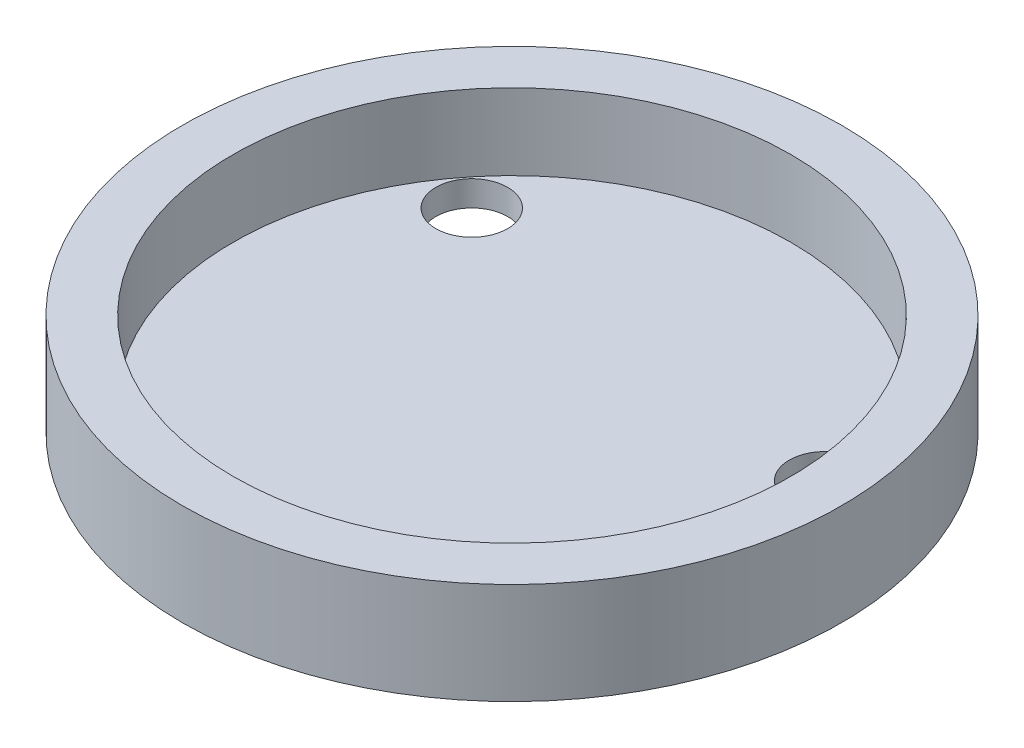
ISO-10303-21;
HEADER;
FILE_DESCRIPTION(('STEP AP214'),'2;1');
FILE_NAME('part.step','',(''),(''),'','','');
FILE_SCHEMA(('AUTOMOTIVE_DESIGN { 1 0 10303 214 1 1 1 1 }'));
ENDSEC;
DATA;
#1=APPLICATION_CONTEXT('core data for automotive mechanical design processes');
#2=APPLICATION_PROTOCOL_DEFINITION('international standard','automotive_design',2000,#1);
#3=PRODUCT_CONTEXT('',#1,'mechanical');
#4=PRODUCT('Part','Part','',(#3));
#5=PRODUCT_RELATED_PRODUCT_CATEGORY('part','',(#4));
#6=PRODUCT_DEFINITION_FORMATION('','',#4);
#7=PRODUCT_DEFINITION_CONTEXT('part definition',#1,'design');
#8=PRODUCT_DEFINITION('design','',#6,#7);
#9=PRODUCT_DEFINITION_SHAPE('','',#8);
#10=(LENGTH_UNIT() NAMED_UNIT(*) SI_UNIT(.MILLI.,.METRE.));
#11=(NAMED_UNIT(*) PLANE_ANGLE_UNIT() SI_UNIT($,.RADIAN.));
#12=(NAMED_UNIT(*) SI_UNIT($,.STERADIAN.) SOLID_ANGLE_UNIT());
#13=UNCERTAINTY_MEASURE_WITH_UNIT(LENGTH_MEASURE(1.E-05),#10,'distance_accuracy_value','');
#14=(GEOMETRIC_REPRESENTATION_CONTEXT(3) GLOBAL_UNCERTAINTY_ASSIGNED_CONTEXT((#13)) GLOBAL_UNIT_ASSIGNED_CONTEXT((#10,
#11,#12)) REPRESENTATION_CONTEXT('',''));
#15=CARTESIAN_POINT('',(0.,0.,0.));
#16=DIRECTION('',(0.,0.,1.));
#17=DIRECTION('',(1.,0.,0.));
#18=AXIS2_PLACEMENT_3D('',#15,#16,#17);
#19=CARTESIAN_POINT('',(0.,20.,0.));
#20=DIRECTION('',(0.,-1.,0.));
#21=DIRECTION('',(0.,0.,-1.));
#22=AXIS2_PLACEMENT_3D('',#19,#20,#21);
#23=CYLINDRICAL_SURFACE('',#22,65.);
#24=CARTESIAN_POINT('',(0.,20.,0.));
#25=DIRECTION('',(0.,1.,0.));
#26=DIRECTION('',(0.,0.,1.));
#27=AXIS2_PLACEMENT_3D('',#24,#25,#26);
#28=CIRCLE('',#27,65.);
#29=CARTESIAN_POINT('',(0.,20.,65.));
#30=VERTEX_POINT('',#29);
#31=EDGE_CURVE('E10',#30,#30,#28,.T.);
#32=ORIENTED_EDGE('',*,*,#31,.F.);
#33=EDGE_LOOP('',(#32));
#34=FACE_BOUND('',#33,.T.);
#35=CARTESIAN_POINT('',(0.,0.,0.));
#36=DIRECTION('',(0.,1.,0.));
#37=DIRECTION('',(0.,0.,1.));
#38=AXIS2_PLACEMENT_3D('',#35,#36,#37);
#39=CIRCLE('',#38,65.);
#40=CARTESIAN_POINT('',(0.,0.,65.));
#41=VERTEX_POINT('',#40);
#42=EDGE_CURVE('E44',#41,#41,#39,.T.);
#43=ORIENTED_EDGE('',*,*,#42,.T.);
#44=EDGE_LOOP('',(#43));
#45=FACE_BOUND('',#44,.T.);
#46=ADVANCED_FACE('F37',(#34,#45),#23,.T.);
#47=CARTESIAN_POINT('',(0.,20.,0.));
#48=DIRECTION('',(0.,1.,0.));
#49=DIRECTION('',(0.,0.,1.));
#50=AXIS2_PLACEMENT_3D('',#47,#48,#49);
#51=PLANE('',#50);
#52=CARTESIAN_POINT('',(0.,20.,0.));
#53=DIRECTION('',(0.,1.,0.));
#54=DIRECTION('',(0.,0.,1.));
#55=AXIS2_PLACEMENT_3D('',#52,#53,#54);
#56=CIRCLE('',#55,55.);
#57=CARTESIAN_POINT('',(0.,20.,55.));
#58=VERTEX_POINT('',#57);
#59=EDGE_CURVE('E52',#58,#58,#56,.T.);
#60=ORIENTED_EDGE('',*,*,#59,.F.);
#61=EDGE_LOOP('',(#60));
#62=FACE_BOUND('',#61,.T.);
#63=ORIENTED_EDGE('',*,*,#31,.T.);
#64=EDGE_LOOP('',(#63));
#65=FACE_BOUND('',#64,.T.);
#66=ADVANCED_FACE('F80',(#62,#65),#51,.T.);
#67=CARTESIAN_POINT('',(0.,0.,0.));
#68=DIRECTION('',(0.,1.,0.));
#69=DIRECTION('',(0.,0.,1.));
#70=AXIS2_PLACEMENT_3D('',#67,#68,#69);
#71=PLANE('',#70);
#72=CARTESIAN_POINT('',(-37.3280172735756,0.,-29.3908017315561));
#73=DIRECTION('',(0.,-1.,0.));
#74=DIRECTION('',(0.,0.,-1.));
#75=AXIS2_PLACEMENT_3D('',#72,#73,#74);
#76=CIRCLE('',#75,7.075);
#77=CARTESIAN_POINT('',(-37.3280172735756,0.,-36.4658017315561));
#78=VERTEX_POINT('',#77);
#79=EDGE_CURVE('E70',#78,#78,#76,.T.);
#80=ORIENTED_EDGE('',*,*,#79,.F.);
#81=EDGE_LOOP('',(#80));
#82=FACE_BOUND('',#81,.T.);
#83=CARTESIAN_POINT('',(-6.78917230033192,0.,47.0224120975988));
#84=DIRECTION('',(0.,-1.,0.));
#85=DIRECTION('',(0.,0.,-1.));
#86=AXIS2_PLACEMENT_3D('',#83,#84,#85);
#87=CIRCLE('',#86,7.075);
#88=CARTESIAN_POINT('',(-6.78917230033192,0.,39.9474120975988));
#89=VERTEX_POINT('',#88);
#90=EDGE_CURVE('E60',#89,#89,#87,.T.);
#91=ORIENTED_EDGE('',*,*,#90,.F.);
#92=EDGE_LOOP('',(#91));
#93=FACE_BOUND('',#92,.T.);
#94=CARTESIAN_POINT('',(44.1171895739071,0.,-17.6316103660425));
#95=DIRECTION('',(0.,-1.,0.));
#96=DIRECTION('',(0.,0.,-1.));
#97=AXIS2_PLACEMENT_3D('',#94,#95,#96);
#98=CIRCLE('',#97,7.075);
#99=CARTESIAN_POINT('',(44.1171895739071,0.,-24.7066103660425));
#100=VERTEX_POINT('',#99);
#101=EDGE_CURVE('E57',#100,#100,#98,.T.);
#102=ORIENTED_EDGE('',*,*,#101,.F.);
#103=EDGE_LOOP('',(#102));
#104=FACE_BOUND('',#103,.T.);
#105=ORIENTED_EDGE('',*,*,#42,.F.);
#106=EDGE_LOOP('',(#105));
#107=FACE_BOUND('',#106,.T.);
#108=ADVANCED_FACE('F82',(#82,#93,#104,#107),#71,.F.);
#109=CARTESIAN_POINT('',(0.,5.,0.));
#110=DIRECTION('',(0.,1.,0.));
#111=DIRECTION('',(0.,0.,1.));
#112=AXIS2_PLACEMENT_3D('',#109,#110,#111);
#113=CYLINDRICAL_SURFACE('',#112,55.);
#114=CARTESIAN_POINT('',(0.,5.,0.));
#115=DIRECTION('',(0.,1.,0.));
#116=DIRECTION('',(0.,0.,1.));
#117=AXIS2_PLACEMENT_3D('',#114,#115,#116);
#118=CIRCLE('',#117,55.);
#119=CARTESIAN_POINT('',(0.,5.,55.));
#120=VERTEX_POINT('',#119);
#121=EDGE_CURVE('E49',#120,#120,#118,.T.);
#122=ORIENTED_EDGE('',*,*,#121,.F.);
#123=EDGE_LOOP('',(#122));
#124=FACE_BOUND('',#123,.T.);
#125=ORIENTED_EDGE('',*,*,#59,.T.);
#126=EDGE_LOOP('',(#125));
#127=FACE_BOUND('',#126,.T.);
#128=ADVANCED_FACE('F78',(#124,#127),#113,.F.);
#129=CARTESIAN_POINT('',(0.,5.,0.));
#130=DIRECTION('',(0.,1.,0.));
#131=DIRECTION('',(0.,0.,1.));
#132=AXIS2_PLACEMENT_3D('',#129,#130,#131);
#133=PLANE('',#132);
#134=CARTESIAN_POINT('',(-37.3280172735756,5.,-29.3908017315561));
#135=DIRECTION('',(0.,1.,0.));
#136=DIRECTION('',(0.,0.,1.));
#137=AXIS2_PLACEMENT_3D('',#134,#135,#136);
#138=CIRCLE('',#137,7.075);
#139=CARTESIAN_POINT('',(-37.3280172735756,5.,-22.3158017315561));
#140=VERTEX_POINT('',#139);
#141=EDGE_CURVE('E40',#140,#140,#138,.T.);
#142=ORIENTED_EDGE('',*,*,#141,.F.);
#143=EDGE_LOOP('',(#142));
#144=FACE_BOUND('',#143,.T.);
#145=CARTESIAN_POINT('',(-6.78917230033192,5.,47.0224120975988));
#146=DIRECTION('',(0.,1.,0.));
#147=DIRECTION('',(0.,0.,1.));
#148=AXIS2_PLACEMENT_3D('',#145,#146,#147);
#149=CIRCLE('',#148,7.075);
#150=CARTESIAN_POINT('',(-6.78917230033192,5.,54.0974120975988));
#151=VERTEX_POINT('',#150);
#152=EDGE_CURVE('E58',#151,#151,#149,.T.);
#153=ORIENTED_EDGE('',*,*,#152,.F.);
#154=EDGE_LOOP('',(#153));
#155=FACE_BOUND('',#154,.T.);
#156=CARTESIAN_POINT('',(44.1171895739071,5.,-17.6316103660425));
#157=DIRECTION('',(0.,1.,0.));
#158=DIRECTION('',(0.,0.,1.));
#159=AXIS2_PLACEMENT_3D('',#156,#157,#158);
#160=CIRCLE('',#159,7.075);
#161=CARTESIAN_POINT('',(44.1171895739071,5.,-10.5566103660425));
#162=VERTEX_POINT('',#161);
#163=EDGE_CURVE('E55',#162,#162,#160,.T.);
#164=ORIENTED_EDGE('',*,*,#163,.F.);
#165=EDGE_LOOP('',(#164));
#166=FACE_BOUND('',#165,.T.);
#167=ORIENTED_EDGE('',*,*,#121,.T.);
#168=EDGE_LOOP('',(#167));
#169=FACE_BOUND('',#168,.T.);
#170=ADVANCED_FACE('F93',(#144,#155,#166,#169),#133,.T.);
#171=CARTESIAN_POINT('',(44.1171895739071,0.,-17.6316103660425));
#172=DIRECTION('',(0.,-1.,0.));
#173=DIRECTION('',(0.,0.,-1.));
#174=AXIS2_PLACEMENT_3D('',#171,#172,#173);
#175=CYLINDRICAL_SURFACE('',#174,7.075);
#176=ORIENTED_EDGE('',*,*,#163,.T.);
#177=EDGE_LOOP('',(#176));
#178=FACE_BOUND('',#177,.T.);
#179=ORIENTED_EDGE('',*,*,#101,.T.);
#180=EDGE_LOOP('',(#179));
#181=FACE_BOUND('',#180,.T.);
#182=ADVANCED_FACE('F97',(#178,#181),#175,.F.);
#183=CARTESIAN_POINT('',(-6.78917230033192,0.,47.0224120975988));
#184=DIRECTION('',(0.,-1.,0.));
#185=DIRECTION('',(0.,0.,-1.));
#186=AXIS2_PLACEMENT_3D('',#183,#184,#185);
#187=CYLINDRICAL_SURFACE('',#186,7.075);
#188=ORIENTED_EDGE('',*,*,#152,.T.);
#189=EDGE_LOOP('',(#188));
#190=FACE_BOUND('',#189,.T.);
#191=ORIENTED_EDGE('',*,*,#90,.T.);
#192=EDGE_LOOP('',(#191));
#193=FACE_BOUND('',#192,.T.);
#194=ADVANCED_FACE('F101',(#190,#193),#187,.F.);
#195=CARTESIAN_POINT('',(-37.3280172735756,0.,-29.3908017315561));
#196=DIRECTION('',(0.,-1.,0.));
#197=DIRECTION('',(0.,0.,-1.));
#198=AXIS2_PLACEMENT_3D('',#195,#196,#197);
#199=CYLINDRICAL_SURFACE('',#198,7.075);
#200=ORIENTED_EDGE('',*,*,#141,.T.);
#201=EDGE_LOOP('',(#200));
#202=FACE_BOUND('',#201,.T.);
#203=ORIENTED_EDGE('',*,*,#79,.T.);
#204=EDGE_LOOP('',(#203));
#205=FACE_BOUND('',#204,.T.);
#206=ADVANCED_FACE('F105',(#202,#205),#199,.F.);
#207=CLOSED_SHELL('',(#46,#66,#108,#128,#170,#182,#194,#206));
#208=MANIFOLD_SOLID_BREP('B2',#207);
#209=ADVANCED_BREP_SHAPE_REPRESENTATION('',(#18,#208),#14);
#210=SHAPE_DEFINITION_REPRESENTATION(#9,#209);
ENDSEC;
END-ISO-10303-21;
